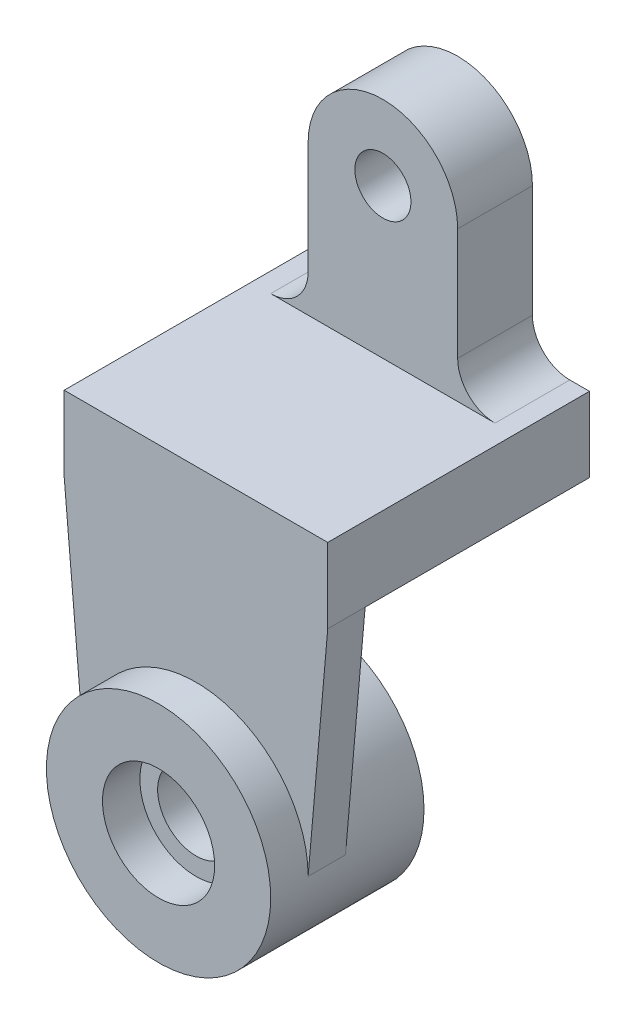
ISO-10303-21;
HEADER;
FILE_DESCRIPTION(('STEP AP214'),'2;1');
FILE_NAME('part.step','',(''),(''),'','','');
FILE_SCHEMA(('AUTOMOTIVE_DESIGN { 1 0 10303 214 1 1 1 1 }'));
ENDSEC;
DATA;
#1=APPLICATION_CONTEXT('core data for automotive mechanical design processes');
#2=APPLICATION_PROTOCOL_DEFINITION('international standard','automotive_design',2000,#1);
#3=PRODUCT_CONTEXT('',#1,'mechanical');
#4=PRODUCT('Part','Part','',(#3));
#5=PRODUCT_RELATED_PRODUCT_CATEGORY('part','',(#4));
#6=PRODUCT_DEFINITION_FORMATION('','',#4);
#7=PRODUCT_DEFINITION_CONTEXT('part definition',#1,'design');
#8=PRODUCT_DEFINITION('design','',#6,#7);
#9=PRODUCT_DEFINITION_SHAPE('','',#8);
#10=(LENGTH_UNIT() NAMED_UNIT(*) SI_UNIT(.MILLI.,.METRE.));
#11=(NAMED_UNIT(*) PLANE_ANGLE_UNIT() SI_UNIT($,.RADIAN.));
#12=(NAMED_UNIT(*) SI_UNIT($,.STERADIAN.) SOLID_ANGLE_UNIT());
#13=UNCERTAINTY_MEASURE_WITH_UNIT(LENGTH_MEASURE(1.E-05),#10,'distance_accuracy_value','');
#14=(GEOMETRIC_REPRESENTATION_CONTEXT(3) GLOBAL_UNCERTAINTY_ASSIGNED_CONTEXT((#13)) GLOBAL_UNIT_ASSIGNED_CONTEXT((#10,
#11,#12)) REPRESENTATION_CONTEXT('',''));
#15=CARTESIAN_POINT('',(0.,0.,0.));
#16=DIRECTION('',(0.,0.,1.));
#17=DIRECTION('',(1.,0.,0.));
#18=AXIS2_PLACEMENT_3D('',#15,#16,#17);
#19=CARTESIAN_POINT('',(0.,0.,0.));
#20=DIRECTION('',(0.,0.,1.));
#21=DIRECTION('',(1.,0.,0.));
#22=AXIS2_PLACEMENT_3D('',#19,#20,#21);
#23=PLANE('',#22);
#24=DIRECTION('',(-1.,0.,0.));
#25=VECTOR('',#24,1.);
#26=CARTESIAN_POINT('',(895.35,1524.,0.));
#27=LINE('',#26,#25);
#28=CARTESIAN_POINT('',(895.35,1524.,0.));
#29=VERTEX_POINT('',#28);
#30=CARTESIAN_POINT('',(-895.35,1524.,0.));
#31=VERTEX_POINT('',#30);
#32=EDGE_CURVE('E173',#29,#31,#27,.T.);
#33=ORIENTED_EDGE('',*,*,#32,.F.);
#34=DIRECTION('',(-0.0871669502809099,-0.996193717496113,0.));
#35=VECTOR('',#34,1.);
#36=CARTESIAN_POINT('',(895.35,1524.,0.));
#37=LINE('',#36,#35);
#38=CARTESIAN_POINT('',(762.,0.,0.));
#39=VERTEX_POINT('',#38);
#40=EDGE_CURVE('E224',#29,#39,#37,.T.);
#41=ORIENTED_EDGE('',*,*,#40,.T.);
#42=CARTESIAN_POINT('',(0.,0.,0.));
#43=DIRECTION('',(0.,0.,1.));
#44=DIRECTION('',(1.,0.,0.));
#45=AXIS2_PLACEMENT_3D('',#42,#43,#44);
#46=CIRCLE('',#45,762.);
#47=CARTESIAN_POINT('',(-762.,-1.94289029309402E-13,0.));
#48=VERTEX_POINT('',#47);
#49=EDGE_CURVE('E47',#39,#48,#46,.T.);
#50=ORIENTED_EDGE('',*,*,#49,.T.);
#51=DIRECTION('',(0.0871669502809099,-0.996193717496113,0.));
#52=VECTOR('',#51,1.);
#53=CARTESIAN_POINT('',(-895.35,1524.,0.));
#54=LINE('',#53,#52);
#55=EDGE_CURVE('E233',#31,#48,#54,.T.);
#56=ORIENTED_EDGE('',*,*,#55,.F.);
#57=EDGE_LOOP('',(#33,#41,#50,#56));
#58=FACE_BOUND('',#57,.T.);
#59=ADVANCED_FACE('F43',(#58),#23,.F.);
#60=CARTESIAN_POINT('',(0.,0.,254.));
#61=DIRECTION('',(0.,0.,1.));
#62=DIRECTION('',(1.,0.,0.));
#63=AXIS2_PLACEMENT_3D('',#60,#61,#62);
#64=PLANE('',#63);
#65=CARTESIAN_POINT('',(0.,0.,254.));
#66=DIRECTION('',(0.,0.,1.));
#67=DIRECTION('',(1.,0.,0.));
#68=AXIS2_PLACEMENT_3D('',#65,#66,#67);
#69=CIRCLE('',#68,260.35);
#70=CARTESIAN_POINT('',(260.35,0.,254.));
#71=VERTEX_POINT('',#70);
#72=EDGE_CURVE('E216',#71,#71,#69,.T.);
#73=ORIENTED_EDGE('',*,*,#72,.F.);
#74=EDGE_LOOP('',(#73));
#75=FACE_BOUND('',#74,.T.);
#76=CARTESIAN_POINT('',(0.,0.,254.));
#77=DIRECTION('',(0.,0.,1.));
#78=DIRECTION('',(1.,0.,0.));
#79=AXIS2_PLACEMENT_3D('',#76,#77,#78);
#80=CIRCLE('',#79,381.);
#81=CARTESIAN_POINT('',(381.,0.,254.));
#82=VERTEX_POINT('',#81);
#83=EDGE_CURVE('E203',#82,#82,#80,.T.);
#84=ORIENTED_EDGE('',*,*,#83,.T.);
#85=EDGE_LOOP('',(#84));
#86=FACE_BOUND('',#85,.T.);
#87=ADVANCED_FACE('F302',(#75,#86),#64,.T.);
#88=CARTESIAN_POINT('',(0.,0.,-533.4));
#89=DIRECTION('',(0.,0.,1.));
#90=DIRECTION('',(1.,0.,0.));
#91=AXIS2_PLACEMENT_3D('',#88,#89,#90);
#92=CYLINDRICAL_SURFACE('',#91,762.);
#93=CARTESIAN_POINT('',(0.,0.,-533.4));
#94=DIRECTION('',(0.,0.,1.));
#95=DIRECTION('',(1.,0.,0.));
#96=AXIS2_PLACEMENT_3D('',#93,#94,#95);
#97=CIRCLE('',#96,762.);
#98=CARTESIAN_POINT('',(762.,0.,-533.4));
#99=VERTEX_POINT('',#98);
#100=EDGE_CURVE('E11',#99,#99,#97,.T.);
#101=ORIENTED_EDGE('',*,*,#100,.T.);
#102=EDGE_LOOP('',(#101));
#103=FACE_BOUND('',#102,.T.);
#104=ORIENTED_EDGE('',*,*,#49,.F.);
#105=DIRECTION('',(0.,0.,-1.));
#106=VECTOR('',#105,1.);
#107=CARTESIAN_POINT('',(762.,0.,254.));
#108=LINE('',#107,#106);
#109=CARTESIAN_POINT('',(762.,0.,254.));
#110=VERTEX_POINT('',#109);
#111=EDGE_CURVE('E263',#110,#39,#108,.T.);
#112=ORIENTED_EDGE('',*,*,#111,.F.);
#113=CARTESIAN_POINT('',(0.,0.,254.));
#114=DIRECTION('',(0.,0.,1.));
#115=DIRECTION('',(1.,0.,0.));
#116=AXIS2_PLACEMENT_3D('',#113,#114,#115);
#117=CIRCLE('',#116,762.);
#118=CARTESIAN_POINT('',(-762.,0.,254.));
#119=VERTEX_POINT('',#118);
#120=EDGE_CURVE('E208',#110,#119,#117,.T.);
#121=ORIENTED_EDGE('',*,*,#120,.T.);
#122=DIRECTION('',(0.,0.,-1.));
#123=VECTOR('',#122,1.);
#124=CARTESIAN_POINT('',(-762.,0.,254.));
#125=LINE('',#124,#123);
#126=EDGE_CURVE('E259',#119,#48,#125,.T.);
#127=ORIENTED_EDGE('',*,*,#126,.T.);
#128=EDGE_LOOP('',(#104,#112,#121,#127));
#129=FACE_BOUND('',#128,.T.);
#130=CARTESIAN_POINT('',(0.,0.,508.));
#131=DIRECTION('',(0.,0.,1.));
#132=DIRECTION('',(1.,0.,0.));
#133=AXIS2_PLACEMENT_3D('',#130,#131,#132);
#134=CIRCLE('',#133,762.);
#135=CARTESIAN_POINT('',(762.,0.,508.));
#136=VERTEX_POINT('',#135);
#137=EDGE_CURVE('E212',#136,#136,#134,.T.);
#138=ORIENTED_EDGE('',*,*,#137,.F.);
#139=EDGE_LOOP('',(#138));
#140=FACE_BOUND('',#139,.T.);
#141=ADVANCED_FACE('F45',(#103,#129,#140),#92,.T.);
#142=CARTESIAN_POINT('',(0.,0.,-533.4));
#143=DIRECTION('',(0.,0.,1.));
#144=DIRECTION('',(1.,0.,0.));
#145=AXIS2_PLACEMENT_3D('',#142,#143,#144);
#146=PLANE('',#145);
#147=CARTESIAN_POINT('',(0.,0.,-533.4));
#148=DIRECTION('',(0.,0.,1.));
#149=DIRECTION('',(1.,0.,0.));
#150=AXIS2_PLACEMENT_3D('',#147,#148,#149);
#151=CIRCLE('',#150,381.);
#152=CARTESIAN_POINT('',(381.,0.,-533.4));
#153=VERTEX_POINT('',#152);
#154=EDGE_CURVE('E273',#153,#153,#151,.T.);
#155=ORIENTED_EDGE('',*,*,#154,.T.);
#156=EDGE_LOOP('',(#155));
#157=FACE_BOUND('',#156,.T.);
#158=ORIENTED_EDGE('',*,*,#100,.F.);
#159=EDGE_LOOP('',(#158));
#160=FACE_BOUND('',#159,.T.);
#161=ADVANCED_FACE('F419',(#157,#160),#146,.F.);
#162=CARTESIAN_POINT('',(0.,0.,-533.4));
#163=DIRECTION('',(0.,0.,1.));
#164=DIRECTION('',(1.,0.,0.));
#165=AXIS2_PLACEMENT_3D('',#162,#163,#164);
#166=CYLINDRICAL_SURFACE('',#165,381.);
#167=ORIENTED_EDGE('',*,*,#154,.F.);
#168=EDGE_LOOP('',(#167));
#169=FACE_BOUND('',#168,.T.);
#170=CARTESIAN_POINT('',(0.,0.,0.));
#171=DIRECTION('',(0.,0.,1.));
#172=DIRECTION('',(1.,0.,0.));
#173=AXIS2_PLACEMENT_3D('',#170,#171,#172);
#174=CIRCLE('',#173,381.);
#175=CARTESIAN_POINT('',(381.,0.,0.));
#176=VERTEX_POINT('',#175);
#177=EDGE_CURVE('E254',#176,#176,#174,.T.);
#178=ORIENTED_EDGE('',*,*,#177,.T.);
#179=EDGE_LOOP('',(#178));
#180=FACE_BOUND('',#179,.T.);
#181=ADVANCED_FACE('F281',(#169,#180),#166,.F.);
#182=ORIENTED_EDGE('',*,*,#120,.F.);
#183=DIRECTION('',(-0.0871669502809099,-0.996193717496113,0.));
#184=VECTOR('',#183,1.);
#185=CARTESIAN_POINT('',(895.35,1524.,254.));
#186=LINE('',#185,#184);
#187=CARTESIAN_POINT('',(895.35,1524.,254.));
#188=VERTEX_POINT('',#187);
#189=EDGE_CURVE('E237',#188,#110,#186,.T.);
#190=ORIENTED_EDGE('',*,*,#189,.F.);
#191=DIRECTION('',(0.,-1.,0.));
#192=VECTOR('',#191,1.);
#193=CARTESIAN_POINT('',(895.35,2032.,254.));
#194=LINE('',#193,#192);
#195=CARTESIAN_POINT('',(895.35,2032.,254.));
#196=VERTEX_POINT('',#195);
#197=EDGE_CURVE('E232',#196,#188,#194,.T.);
#198=ORIENTED_EDGE('',*,*,#197,.F.);
#199=DIRECTION('',(1.,0.,0.));
#200=VECTOR('',#199,1.);
#201=CARTESIAN_POINT('',(-895.35,2032.,254.));
#202=LINE('',#201,#200);
#203=CARTESIAN_POINT('',(-895.35,2032.,254.));
#204=VERTEX_POINT('',#203);
#205=EDGE_CURVE('E228',#204,#196,#202,.T.);
#206=ORIENTED_EDGE('',*,*,#205,.F.);
#207=DIRECTION('',(0.,-1.,0.));
#208=VECTOR('',#207,1.);
#209=CARTESIAN_POINT('',(-895.35,2032.,254.));
#210=LINE('',#209,#208);
#211=CARTESIAN_POINT('',(-895.35,1524.,254.));
#212=VERTEX_POINT('',#211);
#213=EDGE_CURVE('E243',#204,#212,#210,.T.);
#214=ORIENTED_EDGE('',*,*,#213,.T.);
#215=DIRECTION('',(0.0871669502809099,-0.996193717496113,0.));
#216=VECTOR('',#215,1.);
#217=CARTESIAN_POINT('',(-895.35,1524.,254.));
#218=LINE('',#217,#216);
#219=EDGE_CURVE('E240',#212,#119,#218,.T.);
#220=ORIENTED_EDGE('',*,*,#219,.T.);
#221=EDGE_LOOP('',(#182,#190,#198,#206,#214,#220));
#222=FACE_BOUND('',#221,.T.);
#223=ADVANCED_FACE('F307',(#222),#64,.T.);
#224=CARTESIAN_POINT('',(895.35,2032.,254.));
#225=DIRECTION('',(1.,0.,0.));
#226=DIRECTION('',(0.,0.,-1.));
#227=AXIS2_PLACEMENT_3D('',#224,#225,#226);
#228=PLANE('',#227);
#229=DIRECTION('',(0.,-1.,0.));
#230=VECTOR('',#229,1.);
#231=CARTESIAN_POINT('',(895.35,2032.,-1524.));
#232=LINE('',#231,#230);
#233=CARTESIAN_POINT('',(895.35,2032.,-1524.));
#234=VERTEX_POINT('',#233);
#235=CARTESIAN_POINT('',(895.35,1524.,-1524.));
#236=VERTEX_POINT('',#235);
#237=EDGE_CURVE('E183',#234,#236,#232,.T.);
#238=ORIENTED_EDGE('',*,*,#237,.F.);
#239=DIRECTION('',(0.,0.,-1.));
#240=VECTOR('',#239,1.);
#241=CARTESIAN_POINT('',(895.35,2032.,254.));
#242=LINE('',#241,#240);
#243=EDGE_CURVE('E246',#196,#234,#242,.T.);
#244=ORIENTED_EDGE('',*,*,#243,.F.);
#245=ORIENTED_EDGE('',*,*,#197,.T.);
#246=DIRECTION('',(0.,0.,-1.));
#247=VECTOR('',#246,1.);
#248=CARTESIAN_POINT('',(895.35,1524.,254.));
#249=LINE('',#248,#247);
#250=EDGE_CURVE('E267',#188,#29,#249,.T.);
#251=ORIENTED_EDGE('',*,*,#250,.T.);
#252=DIRECTION('',(0.,0.,1.));
#253=VECTOR('',#252,1.);
#254=CARTESIAN_POINT('',(895.35,1524.,-1524.));
#255=LINE('',#254,#253);
#256=EDGE_CURVE('E200',#236,#29,#255,.T.);
#257=ORIENTED_EDGE('',*,*,#256,.F.);
#258=EDGE_LOOP('',(#238,#244,#245,#251,#257));
#259=FACE_BOUND('',#258,.T.);
#260=ADVANCED_FACE('F315',(#259),#228,.T.);
#261=CARTESIAN_POINT('',(895.35,1524.,254.));
#262=DIRECTION('',(0.996193717496113,-0.0871669502809099,0.));
#263=DIRECTION('',(0.0871669502809099,0.996193717496113,0.));
#264=AXIS2_PLACEMENT_3D('',#261,#262,#263);
#265=PLANE('',#264);
#266=ORIENTED_EDGE('',*,*,#40,.F.);
#267=ORIENTED_EDGE('',*,*,#250,.F.);
#268=ORIENTED_EDGE('',*,*,#189,.T.);
#269=ORIENTED_EDGE('',*,*,#111,.T.);
#270=EDGE_LOOP('',(#266,#267,#268,#269));
#271=FACE_BOUND('',#270,.T.);
#272=ADVANCED_FACE('F320',(#271),#265,.T.);
#273=CARTESIAN_POINT('',(-895.35,1524.,254.));
#274=DIRECTION('',(0.996193717496113,0.0871669502809099,0.));
#275=DIRECTION('',(-0.0871669502809099,0.996193717496113,0.));
#276=AXIS2_PLACEMENT_3D('',#273,#274,#275);
#277=PLANE('',#276);
#278=ORIENTED_EDGE('',*,*,#55,.T.);
#279=ORIENTED_EDGE('',*,*,#126,.F.);
#280=ORIENTED_EDGE('',*,*,#219,.F.);
#281=DIRECTION('',(0.,0.,-1.));
#282=VECTOR('',#281,1.);
#283=CARTESIAN_POINT('',(-895.35,1524.,254.));
#284=LINE('',#283,#282);
#285=EDGE_CURVE('E255',#212,#31,#284,.T.);
#286=ORIENTED_EDGE('',*,*,#285,.T.);
#287=EDGE_LOOP('',(#278,#279,#280,#286));
#288=FACE_BOUND('',#287,.T.);
#289=ADVANCED_FACE('F332',(#288),#277,.F.);
#290=CARTESIAN_POINT('',(-895.35,2032.,254.));
#291=DIRECTION('',(1.,0.,0.));
#292=DIRECTION('',(0.,0.,-1.));
#293=AXIS2_PLACEMENT_3D('',#290,#291,#292);
#294=PLANE('',#293);
#295=DIRECTION('',(0.,0.,1.));
#296=VECTOR('',#295,1.);
#297=CARTESIAN_POINT('',(-895.35,1524.,-1524.));
#298=LINE('',#297,#296);
#299=CARTESIAN_POINT('',(-895.35,1524.,-1524.));
#300=VERTEX_POINT('',#299);
#301=EDGE_CURVE('E194',#300,#31,#298,.T.);
#302=ORIENTED_EDGE('',*,*,#301,.T.);
#303=ORIENTED_EDGE('',*,*,#285,.F.);
#304=ORIENTED_EDGE('',*,*,#213,.F.);
#305=DIRECTION('',(0.,0.,-1.));
#306=VECTOR('',#305,1.);
#307=CARTESIAN_POINT('',(-895.35,2032.,254.));
#308=LINE('',#307,#306);
#309=CARTESIAN_POINT('',(-895.35,2032.,-1524.));
#310=VERTEX_POINT('',#309);
#311=EDGE_CURVE('E251',#204,#310,#308,.T.);
#312=ORIENTED_EDGE('',*,*,#311,.T.);
#313=DIRECTION('',(0.,1.,0.));
#314=VECTOR('',#313,1.);
#315=CARTESIAN_POINT('',(-895.35,1524.,-1524.));
#316=LINE('',#315,#314);
#317=EDGE_CURVE('E190',#300,#310,#316,.T.);
#318=ORIENTED_EDGE('',*,*,#317,.F.);
#319=EDGE_LOOP('',(#302,#303,#304,#312,#318));
#320=FACE_BOUND('',#319,.T.);
#321=ADVANCED_FACE('F296',(#320),#294,.F.);
#322=CARTESIAN_POINT('',(-895.35,2032.,254.));
#323=DIRECTION('',(0.,1.,0.));
#324=DIRECTION('',(0.,0.,1.));
#325=AXIS2_PLACEMENT_3D('',#322,#323,#324);
#326=PLANE('',#325);
#327=DIRECTION('',(0.,0.,-1.));
#328=VECTOR('',#327,1.);
#329=CARTESIAN_POINT('',(762.,2032.,-1016.));
#330=LINE('',#329,#328);
#331=CARTESIAN_POINT('',(762.,2032.,-1016.));
#332=VERTEX_POINT('',#331);
#333=CARTESIAN_POINT('',(762.,2032.,-1524.));
#334=VERTEX_POINT('',#333);
#335=EDGE_CURVE('E175',#332,#334,#330,.T.);
#336=ORIENTED_EDGE('',*,*,#335,.F.);
#337=DIRECTION('',(-1.,0.,0.));
#338=VECTOR('',#337,1.);
#339=CARTESIAN_POINT('',(-895.35,2032.,-1016.));
#340=LINE('',#339,#338);
#341=CARTESIAN_POINT('',(-762.,2032.,-1016.));
#342=VERTEX_POINT('',#341);
#343=EDGE_CURVE('E169',#332,#342,#340,.T.);
#344=ORIENTED_EDGE('',*,*,#343,.T.);
#345=DIRECTION('',(0.,0.,-1.));
#346=VECTOR('',#345,1.);
#347=CARTESIAN_POINT('',(-762.,2032.,-1016.));
#348=LINE('',#347,#346);
#349=CARTESIAN_POINT('',(-762.,2032.,-1524.));
#350=VERTEX_POINT('',#349);
#351=EDGE_CURVE('E148',#342,#350,#348,.T.);
#352=ORIENTED_EDGE('',*,*,#351,.T.);
#353=DIRECTION('',(1.,0.,0.));
#354=VECTOR('',#353,1.);
#355=CARTESIAN_POINT('',(-895.35,2032.,-1524.));
#356=LINE('',#355,#354);
#357=EDGE_CURVE('E179',#310,#350,#356,.T.);
#358=ORIENTED_EDGE('',*,*,#357,.F.);
#359=ORIENTED_EDGE('',*,*,#311,.F.);
#360=ORIENTED_EDGE('',*,*,#205,.T.);
#361=ORIENTED_EDGE('',*,*,#243,.T.);
#362=EDGE_CURVE('E184',#334,#234,#356,.T.);
#363=ORIENTED_EDGE('',*,*,#362,.F.);
#364=EDGE_LOOP('',(#336,#344,#352,#358,#359,#360,#361,#363));
#365=FACE_BOUND('',#364,.T.);
#366=ADVANCED_FACE('F286',(#365),#326,.T.);
#367=CARTESIAN_POINT('',(0.,0.,0.));
#368=DIRECTION('',(0.,0.,1.));
#369=DIRECTION('',(1.,0.,0.));
#370=AXIS2_PLACEMENT_3D('',#367,#368,#369);
#371=CIRCLE('',#370,260.35);
#372=CARTESIAN_POINT('',(260.35,0.,0.));
#373=VERTEX_POINT('',#372);
#374=EDGE_CURVE('E220',#373,#373,#371,.T.);
#375=ORIENTED_EDGE('',*,*,#374,.T.);
#376=EDGE_LOOP('',(#375));
#377=FACE_BOUND('',#376,.T.);
#378=ORIENTED_EDGE('',*,*,#177,.F.);
#379=EDGE_LOOP('',(#378));
#380=FACE_BOUND('',#379,.T.);
#381=ADVANCED_FACE('F283',(#377,#380),#23,.F.);
#382=CARTESIAN_POINT('',(0.,0.,0.));
#383=DIRECTION('',(0.,0.,1.));
#384=DIRECTION('',(1.,0.,0.));
#385=AXIS2_PLACEMENT_3D('',#382,#383,#384);
#386=CYLINDRICAL_SURFACE('',#385,260.35);
#387=ORIENTED_EDGE('',*,*,#374,.F.);
#388=EDGE_LOOP('',(#387));
#389=FACE_BOUND('',#388,.T.);
#390=ORIENTED_EDGE('',*,*,#72,.T.);
#391=EDGE_LOOP('',(#390));
#392=FACE_BOUND('',#391,.T.);
#393=ADVANCED_FACE('F285',(#389,#392),#386,.F.);
#394=CARTESIAN_POINT('',(0.,0.,508.));
#395=DIRECTION('',(0.,0.,1.));
#396=DIRECTION('',(1.,0.,0.));
#397=AXIS2_PLACEMENT_3D('',#394,#395,#396);
#398=PLANE('',#397);
#399=ORIENTED_EDGE('',*,*,#137,.T.);
#400=EDGE_LOOP('',(#399));
#401=FACE_BOUND('',#400,.T.);
#402=CARTESIAN_POINT('',(0.,0.,508.));
#403=DIRECTION('',(0.,0.,1.));
#404=DIRECTION('',(1.,0.,0.));
#405=AXIS2_PLACEMENT_3D('',#402,#403,#404);
#406=CIRCLE('',#405,381.);
#407=CARTESIAN_POINT('',(381.,0.,508.));
#408=VERTEX_POINT('',#407);
#409=EDGE_CURVE('E204',#408,#408,#406,.T.);
#410=ORIENTED_EDGE('',*,*,#409,.F.);
#411=EDGE_LOOP('',(#410));
#412=FACE_BOUND('',#411,.T.);
#413=ADVANCED_FACE('F293',(#401,#412),#398,.T.);
#414=CARTESIAN_POINT('',(0.,0.,508.));
#415=DIRECTION('',(0.,0.,-1.));
#416=DIRECTION('',(-1.,0.,0.));
#417=AXIS2_PLACEMENT_3D('',#414,#415,#416);
#418=CYLINDRICAL_SURFACE('',#417,381.);
#419=ORIENTED_EDGE('',*,*,#409,.T.);
#420=EDGE_LOOP('',(#419));
#421=FACE_BOUND('',#420,.T.);
#422=ORIENTED_EDGE('',*,*,#83,.F.);
#423=EDGE_LOOP('',(#422));
#424=FACE_BOUND('',#423,.T.);
#425=ADVANCED_FACE('F404',(#421,#424),#418,.F.);
#426=CARTESIAN_POINT('',(895.35,1524.,-1524.));
#427=DIRECTION('',(0.,1.,0.));
#428=DIRECTION('',(0.,0.,1.));
#429=AXIS2_PLACEMENT_3D('',#426,#427,#428);
#430=PLANE('',#429);
#431=ORIENTED_EDGE('',*,*,#256,.T.);
#432=ORIENTED_EDGE('',*,*,#32,.T.);
#433=ORIENTED_EDGE('',*,*,#301,.F.);
#434=DIRECTION('',(-1.,0.,0.));
#435=VECTOR('',#434,1.);
#436=CARTESIAN_POINT('',(895.35,1524.,-1524.));
#437=LINE('',#436,#435);
#438=EDGE_CURVE('E187',#236,#300,#437,.T.);
#439=ORIENTED_EDGE('',*,*,#438,.F.);
#440=EDGE_LOOP('',(#431,#432,#433,#439));
#441=FACE_BOUND('',#440,.T.);
#442=ADVANCED_FACE('F335',(#441),#430,.F.);
#443=CARTESIAN_POINT('',(0.,0.,-1524.));
#444=DIRECTION('',(0.,0.,-1.));
#445=DIRECTION('',(-1.,0.,0.));
#446=AXIS2_PLACEMENT_3D('',#443,#444,#445);
#447=PLANE('',#446);
#448=CARTESIAN_POINT('',(0.,3048.,-1524.));
#449=DIRECTION('',(0.,0.,-1.));
#450=DIRECTION('',(-1.,0.,0.));
#451=AXIS2_PLACEMENT_3D('',#448,#449,#450);
#452=CIRCLE('',#451,190.5);
#453=CARTESIAN_POINT('',(-190.5,3048.,-1524.));
#454=VERTEX_POINT('',#453);
#455=EDGE_CURVE('E382',#454,#454,#452,.T.);
#456=ORIENTED_EDGE('',*,*,#455,.F.);
#457=EDGE_LOOP('',(#456));
#458=FACE_BOUND('',#457,.T.);
#459=ORIENTED_EDGE('',*,*,#357,.T.);
#460=CARTESIAN_POINT('',(-762.,2286.,-1524.));
#461=DIRECTION('',(0.,0.,-1.));
#462=DIRECTION('',(-1.,0.,0.));
#463=AXIS2_PLACEMENT_3D('',#460,#461,#462);
#464=CIRCLE('',#463,254.);
#465=CARTESIAN_POINT('',(-508.,2286.,-1524.));
#466=VERTEX_POINT('',#465);
#467=EDGE_CURVE('E340',#466,#350,#464,.T.);
#468=ORIENTED_EDGE('',*,*,#467,.F.);
#469=DIRECTION('',(0.,-1.,0.));
#470=VECTOR('',#469,1.);
#471=CARTESIAN_POINT('',(-508.,3048.,-1524.));
#472=LINE('',#471,#470);
#473=CARTESIAN_POINT('',(-508.,3048.,-1524.));
#474=VERTEX_POINT('',#473);
#475=EDGE_CURVE('E167',#474,#466,#472,.T.);
#476=ORIENTED_EDGE('',*,*,#475,.F.);
#477=CARTESIAN_POINT('',(0.,3048.,-1524.));
#478=DIRECTION('',(0.,0.,-1.));
#479=DIRECTION('',(-1.,0.,0.));
#480=AXIS2_PLACEMENT_3D('',#477,#478,#479);
#481=CIRCLE('',#480,508.);
#482=CARTESIAN_POINT('',(508.,3048.,-1524.));
#483=VERTEX_POINT('',#482);
#484=EDGE_CURVE('E163',#474,#483,#481,.T.);
#485=ORIENTED_EDGE('',*,*,#484,.T.);
#486=DIRECTION('',(0.,-1.,0.));
#487=VECTOR('',#486,1.);
#488=CARTESIAN_POINT('',(508.,3048.,-1524.));
#489=LINE('',#488,#487);
#490=CARTESIAN_POINT('',(508.,2286.,-1524.));
#491=VERTEX_POINT('',#490);
#492=EDGE_CURVE('E347',#483,#491,#489,.T.);
#493=ORIENTED_EDGE('',*,*,#492,.T.);
#494=CARTESIAN_POINT('',(762.,2286.,-1524.));
#495=DIRECTION('',(0.,0.,-1.));
#496=DIRECTION('',(-1.,0.,0.));
#497=AXIS2_PLACEMENT_3D('',#494,#495,#496);
#498=CIRCLE('',#497,254.);
#499=EDGE_CURVE('E59',#334,#491,#498,.T.);
#500=ORIENTED_EDGE('',*,*,#499,.F.);
#501=ORIENTED_EDGE('',*,*,#362,.T.);
#502=ORIENTED_EDGE('',*,*,#237,.T.);
#503=ORIENTED_EDGE('',*,*,#438,.T.);
#504=ORIENTED_EDGE('',*,*,#317,.T.);
#505=EDGE_LOOP('',(#459,#468,#476,#485,#493,#500,#501,#502,#503,#504));
#506=FACE_BOUND('',#505,.T.);
#507=ADVANCED_FACE('F336',(#458,#506),#447,.T.);
#508=CARTESIAN_POINT('',(-508.,3048.,-1016.));
#509=DIRECTION('',(1.,0.,0.));
#510=DIRECTION('',(0.,0.,-1.));
#511=AXIS2_PLACEMENT_3D('',#508,#509,#510);
#512=PLANE('',#511);
#513=ORIENTED_EDGE('',*,*,#475,.T.);
#514=DIRECTION('',(0.,0.,-1.));
#515=VECTOR('',#514,1.);
#516=CARTESIAN_POINT('',(-508.,2286.,-1016.));
#517=LINE('',#516,#515);
#518=CARTESIAN_POINT('',(-508.,2286.,-1016.));
#519=VERTEX_POINT('',#518);
#520=EDGE_CURVE('E145',#519,#466,#517,.T.);
#521=ORIENTED_EDGE('',*,*,#520,.F.);
#522=DIRECTION('',(0.,-1.,0.));
#523=VECTOR('',#522,1.);
#524=CARTESIAN_POINT('',(-508.,3048.,-1016.));
#525=LINE('',#524,#523);
#526=CARTESIAN_POINT('',(-508.,3048.,-1016.));
#527=VERTEX_POINT('',#526);
#528=EDGE_CURVE('E153',#527,#519,#525,.T.);
#529=ORIENTED_EDGE('',*,*,#528,.F.);
#530=DIRECTION('',(0.,0.,-1.));
#531=VECTOR('',#530,1.);
#532=CARTESIAN_POINT('',(-508.,3048.,-1016.));
#533=LINE('',#532,#531);
#534=EDGE_CURVE('E357',#527,#474,#533,.T.);
#535=ORIENTED_EDGE('',*,*,#534,.T.);
#536=EDGE_LOOP('',(#513,#521,#529,#535));
#537=FACE_BOUND('',#536,.T.);
#538=ADVANCED_FACE('F165',(#537),#512,.F.);
#539=CARTESIAN_POINT('',(-762.,2286.,-1016.));
#540=DIRECTION('',(0.,0.,-1.));
#541=DIRECTION('',(-1.,0.,0.));
#542=AXIS2_PLACEMENT_3D('',#539,#540,#541);
#543=CYLINDRICAL_SURFACE('',#542,254.);
#544=ORIENTED_EDGE('',*,*,#467,.T.);
#545=ORIENTED_EDGE('',*,*,#351,.F.);
#546=CARTESIAN_POINT('',(-762.,2286.,-1016.));
#547=DIRECTION('',(0.,0.,-1.));
#548=DIRECTION('',(-1.,0.,0.));
#549=AXIS2_PLACEMENT_3D('',#546,#547,#548);
#550=CIRCLE('',#549,254.);
#551=EDGE_CURVE('E141',#519,#342,#550,.T.);
#552=ORIENTED_EDGE('',*,*,#551,.F.);
#553=ORIENTED_EDGE('',*,*,#520,.T.);
#554=EDGE_LOOP('',(#544,#545,#552,#553));
#555=FACE_BOUND('',#554,.T.);
#556=ADVANCED_FACE('F143',(#555),#543,.F.);
#557=CARTESIAN_POINT('',(762.,2286.,-1016.));
#558=DIRECTION('',(0.,0.,-1.));
#559=DIRECTION('',(-1.,0.,0.));
#560=AXIS2_PLACEMENT_3D('',#557,#558,#559);
#561=CYLINDRICAL_SURFACE('',#560,254.);
#562=ORIENTED_EDGE('',*,*,#499,.T.);
#563=DIRECTION('',(0.,0.,-1.));
#564=VECTOR('',#563,1.);
#565=CARTESIAN_POINT('',(508.,2286.,-1016.));
#566=LINE('',#565,#564);
#567=CARTESIAN_POINT('',(508.,2286.,-1016.));
#568=VERTEX_POINT('',#567);
#569=EDGE_CURVE('E363',#568,#491,#566,.T.);
#570=ORIENTED_EDGE('',*,*,#569,.F.);
#571=CARTESIAN_POINT('',(762.,2286.,-1016.));
#572=DIRECTION('',(0.,0.,-1.));
#573=DIRECTION('',(-1.,0.,0.));
#574=AXIS2_PLACEMENT_3D('',#571,#572,#573);
#575=CIRCLE('',#574,254.);
#576=EDGE_CURVE('E152',#332,#568,#575,.T.);
#577=ORIENTED_EDGE('',*,*,#576,.F.);
#578=ORIENTED_EDGE('',*,*,#335,.T.);
#579=EDGE_LOOP('',(#562,#570,#577,#578));
#580=FACE_BOUND('',#579,.T.);
#581=ADVANCED_FACE('F368',(#580),#561,.F.);
#582=CARTESIAN_POINT('',(508.,3048.,-1016.));
#583=DIRECTION('',(1.,0.,0.));
#584=DIRECTION('',(0.,0.,-1.));
#585=AXIS2_PLACEMENT_3D('',#582,#583,#584);
#586=PLANE('',#585);
#587=ORIENTED_EDGE('',*,*,#492,.F.);
#588=DIRECTION('',(0.,0.,-1.));
#589=VECTOR('',#588,1.);
#590=CARTESIAN_POINT('',(508.,3048.,-1016.));
#591=LINE('',#590,#589);
#592=CARTESIAN_POINT('',(508.,3048.,-1016.));
#593=VERTEX_POINT('',#592);
#594=EDGE_CURVE('E360',#593,#483,#591,.T.);
#595=ORIENTED_EDGE('',*,*,#594,.F.);
#596=DIRECTION('',(0.,-1.,0.));
#597=VECTOR('',#596,1.);
#598=CARTESIAN_POINT('',(508.,3048.,-1016.));
#599=LINE('',#598,#597);
#600=EDGE_CURVE('E372',#593,#568,#599,.T.);
#601=ORIENTED_EDGE('',*,*,#600,.T.);
#602=ORIENTED_EDGE('',*,*,#569,.T.);
#603=EDGE_LOOP('',(#587,#595,#601,#602));
#604=FACE_BOUND('',#603,.T.);
#605=ADVANCED_FACE('F377',(#604),#586,.T.);
#606=CARTESIAN_POINT('',(0.,3048.,-1016.));
#607=DIRECTION('',(0.,0.,-1.));
#608=DIRECTION('',(-1.,0.,0.));
#609=AXIS2_PLACEMENT_3D('',#606,#607,#608);
#610=CYLINDRICAL_SURFACE('',#609,508.);
#611=ORIENTED_EDGE('',*,*,#484,.F.);
#612=ORIENTED_EDGE('',*,*,#534,.F.);
#613=CARTESIAN_POINT('',(0.,3048.,-1016.));
#614=DIRECTION('',(0.,0.,-1.));
#615=DIRECTION('',(-1.,0.,0.));
#616=AXIS2_PLACEMENT_3D('',#613,#614,#615);
#617=CIRCLE('',#616,508.);
#618=EDGE_CURVE('E160',#527,#593,#617,.T.);
#619=ORIENTED_EDGE('',*,*,#618,.T.);
#620=ORIENTED_EDGE('',*,*,#594,.T.);
#621=EDGE_LOOP('',(#611,#612,#619,#620));
#622=FACE_BOUND('',#621,.T.);
#623=ADVANCED_FACE('F484',(#622),#610,.T.);
#624=CARTESIAN_POINT('',(-762.,2286.,-1016.));
#625=DIRECTION('',(0.,0.,-1.));
#626=DIRECTION('',(-1.,0.,0.));
#627=AXIS2_PLACEMENT_3D('',#624,#625,#626);
#628=PLANE('',#627);
#629=CARTESIAN_POINT('',(0.,3048.,-1016.));
#630=DIRECTION('',(0.,0.,-1.));
#631=DIRECTION('',(-1.,0.,0.));
#632=AXIS2_PLACEMENT_3D('',#629,#630,#631);
#633=CIRCLE('',#632,190.5);
#634=CARTESIAN_POINT('',(-190.5,3048.,-1016.));
#635=VERTEX_POINT('',#634);
#636=EDGE_CURVE('E349',#635,#635,#633,.T.);
#637=ORIENTED_EDGE('',*,*,#636,.T.);
#638=EDGE_LOOP('',(#637));
#639=FACE_BOUND('',#638,.T.);
#640=ORIENTED_EDGE('',*,*,#343,.F.);
#641=ORIENTED_EDGE('',*,*,#576,.T.);
#642=ORIENTED_EDGE('',*,*,#600,.F.);
#643=ORIENTED_EDGE('',*,*,#618,.F.);
#644=ORIENTED_EDGE('',*,*,#528,.T.);
#645=ORIENTED_EDGE('',*,*,#551,.T.);
#646=EDGE_LOOP('',(#640,#641,#642,#643,#644,#645));
#647=FACE_BOUND('',#646,.T.);
#648=ADVANCED_FACE('F157',(#639,#647),#628,.F.);
#649=CARTESIAN_POINT('',(0.,3048.,-1016.));
#650=DIRECTION('',(0.,0.,-1.));
#651=DIRECTION('',(-1.,0.,0.));
#652=AXIS2_PLACEMENT_3D('',#649,#650,#651);
#653=CYLINDRICAL_SURFACE('',#652,190.5);
#654=ORIENTED_EDGE('',*,*,#636,.F.);
#655=EDGE_LOOP('',(#654));
#656=FACE_BOUND('',#655,.T.);
#657=ORIENTED_EDGE('',*,*,#455,.T.);
#658=EDGE_LOOP('',(#657));
#659=FACE_BOUND('',#658,.T.);
#660=ADVANCED_FACE('F391',(#656,#659),#653,.F.);
#661=CLOSED_SHELL('',(#59,#87,#141,#161,#181,#223,#260,#272,#289,#321,#366,#381,#393,#413,#425,
#442,#507,#538,#556,#581,#605,#623,#648,#660));
#662=MANIFOLD_SOLID_BREP('B2',#661);
#663=ADVANCED_BREP_SHAPE_REPRESENTATION('',(#18,#662),#14);
#664=SHAPE_DEFINITION_REPRESENTATION(#9,#663);
ENDSEC;
END-ISO-10303-21;
